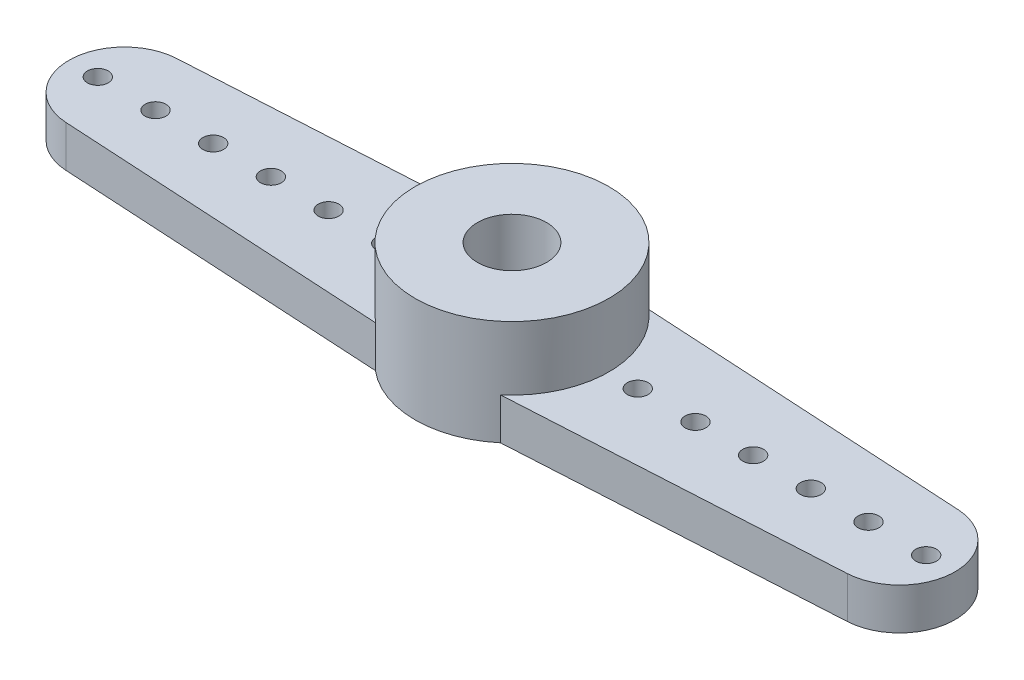
ISO-10303-21;
HEADER;
FILE_DESCRIPTION(('STEP AP214'),'2;1');
FILE_NAME('part.step','',(''),(''),'','','');
FILE_SCHEMA(('AUTOMOTIVE_DESIGN { 1 0 10303 214 1 1 1 1 }'));
ENDSEC;
DATA;
#1=APPLICATION_CONTEXT('core data for automotive mechanical design processes');
#2=APPLICATION_PROTOCOL_DEFINITION('international standard','automotive_design',2000,#1);
#3=PRODUCT_CONTEXT('',#1,'mechanical');
#4=PRODUCT('Part','Part','',(#3));
#5=PRODUCT_RELATED_PRODUCT_CATEGORY('part','',(#4));
#6=PRODUCT_DEFINITION_FORMATION('','',#4);
#7=PRODUCT_DEFINITION_CONTEXT('part definition',#1,'design');
#8=PRODUCT_DEFINITION('design','',#6,#7);
#9=PRODUCT_DEFINITION_SHAPE('','',#8);
#10=(LENGTH_UNIT() NAMED_UNIT(*) SI_UNIT(.MILLI.,.METRE.));
#11=(NAMED_UNIT(*) PLANE_ANGLE_UNIT() SI_UNIT($,.RADIAN.));
#12=(NAMED_UNIT(*) SI_UNIT($,.STERADIAN.) SOLID_ANGLE_UNIT());
#13=UNCERTAINTY_MEASURE_WITH_UNIT(LENGTH_MEASURE(1.E-05),#10,'distance_accuracy_value','');
#14=(GEOMETRIC_REPRESENTATION_CONTEXT(3) GLOBAL_UNCERTAINTY_ASSIGNED_CONTEXT((#13)) GLOBAL_UNIT_ASSIGNED_CONTEXT((#10,
#11,#12)) REPRESENTATION_CONTEXT('',''));
#15=CARTESIAN_POINT('',(0.,0.,0.));
#16=DIRECTION('',(0.,0.,1.));
#17=DIRECTION('',(1.,0.,0.));
#18=AXIS2_PLACEMENT_3D('',#15,#16,#17);
#19=CARTESIAN_POINT('',(0.,1.5,0.));
#20=DIRECTION('',(0.,-1.,0.));
#21=DIRECTION('',(0.,0.,-1.));
#22=AXIS2_PLACEMENT_3D('',#19,#20,#21);
#23=CYLINDRICAL_SURFACE('',#22,3.5);
#24=CARTESIAN_POINT('',(0.,1.5,0.));
#25=DIRECTION('',(0.,1.,0.));
#26=DIRECTION('',(0.,0.,1.));
#27=AXIS2_PLACEMENT_3D('',#24,#25,#26);
#28=CIRCLE('',#27,3.5);
#29=CARTESIAN_POINT('',(-2.25707221860533,1.5,-2.675));
#30=VERTEX_POINT('',#29);
#31=CARTESIAN_POINT('',(-2.25707221860533,1.5,2.675));
#32=VERTEX_POINT('',#31);
#33=EDGE_CURVE('E58',#30,#32,#28,.T.);
#34=ORIENTED_EDGE('',*,*,#33,.T.);
#35=DIRECTION('',(0.,-1.,0.));
#36=VECTOR('',#35,1.);
#37=CARTESIAN_POINT('',(-2.25707221860533,1.5,2.675));
#38=LINE('',#37,#36);
#39=CARTESIAN_POINT('',(-2.25707221860533,0.,2.675));
#40=VERTEX_POINT('',#39);
#41=EDGE_CURVE('E134',#32,#40,#38,.T.);
#42=ORIENTED_EDGE('',*,*,#41,.T.);
#43=CARTESIAN_POINT('',(0.,0.,0.));
#44=DIRECTION('',(0.,1.,0.));
#45=DIRECTION('',(0.,0.,1.));
#46=AXIS2_PLACEMENT_3D('',#43,#44,#45);
#47=CIRCLE('',#46,3.5);
#48=CARTESIAN_POINT('',(2.25707221860533,0.,2.675));
#49=VERTEX_POINT('',#48);
#50=EDGE_CURVE('E214',#40,#49,#47,.T.);
#51=ORIENTED_EDGE('',*,*,#50,.T.);
#52=DIRECTION('',(0.,-1.,0.));
#53=VECTOR('',#52,1.);
#54=CARTESIAN_POINT('',(2.25707221860533,1.5,2.675));
#55=LINE('',#54,#53);
#56=CARTESIAN_POINT('',(2.25707221860533,1.5,2.675));
#57=VERTEX_POINT('',#56);
#58=EDGE_CURVE('E12',#57,#49,#55,.T.);
#59=ORIENTED_EDGE('',*,*,#58,.F.);
#60=CARTESIAN_POINT('',(0.,1.5,0.));
#61=DIRECTION('',(0.,1.,0.));
#62=DIRECTION('',(0.,0.,1.));
#63=AXIS2_PLACEMENT_3D('',#60,#61,#62);
#64=CIRCLE('',#63,3.5);
#65=CARTESIAN_POINT('',(2.25707221860533,1.5,-2.675));
#66=VERTEX_POINT('',#65);
#67=EDGE_CURVE('E206',#57,#66,#64,.T.);
#68=ORIENTED_EDGE('',*,*,#67,.T.);
#69=DIRECTION('',(0.,-1.,0.));
#70=VECTOR('',#69,1.);
#71=CARTESIAN_POINT('',(2.25707221860533,1.5,-2.675));
#72=LINE('',#71,#70);
#73=CARTESIAN_POINT('',(2.25707221860533,0.,-2.675));
#74=VERTEX_POINT('',#73);
#75=EDGE_CURVE('E225',#66,#74,#72,.T.);
#76=ORIENTED_EDGE('',*,*,#75,.T.);
#77=CARTESIAN_POINT('',(-2.25707221860533,0.,-2.675));
#78=VERTEX_POINT('',#77);
#79=EDGE_CURVE('E226',#74,#78,#47,.T.);
#80=ORIENTED_EDGE('',*,*,#79,.T.);
#81=DIRECTION('',(0.,-1.,0.));
#82=VECTOR('',#81,1.);
#83=CARTESIAN_POINT('',(-2.25707221860533,1.5,-2.675));
#84=LINE('',#83,#82);
#85=EDGE_CURVE('E63',#30,#78,#84,.T.);
#86=ORIENTED_EDGE('',*,*,#85,.F.);
#87=EDGE_LOOP('',(#34,#42,#51,#59,#68,#76,#80,#86));
#88=FACE_BOUND('',#87,.T.);
#89=CARTESIAN_POINT('',(0.,3.8,0.));
#90=DIRECTION('',(0.,1.,0.));
#91=DIRECTION('',(0.,0.,1.));
#92=AXIS2_PLACEMENT_3D('',#89,#90,#91);
#93=CIRCLE('',#92,3.5);
#94=CARTESIAN_POINT('',(0.,3.8,3.5));
#95=VERTEX_POINT('',#94);
#96=EDGE_CURVE('E210',#95,#95,#93,.T.);
#97=ORIENTED_EDGE('',*,*,#96,.F.);
#98=EDGE_LOOP('',(#97));
#99=FACE_BOUND('',#98,.T.);
#100=ADVANCED_FACE('F41',(#88,#99),#23,.T.);
#101=CARTESIAN_POINT('',(14.1106495792047,1.5,2.));
#102=DIRECTION('',(-0.0568527304419953,0.,-0.998382575489622));
#103=DIRECTION('',(-0.998382575489622,0.,0.0568527304419953));
#104=AXIS2_PLACEMENT_3D('',#101,#102,#103);
#105=PLANE('',#104);
#106=DIRECTION('',(0.998382575489622,0.,-0.0568527304419953));
#107=VECTOR('',#106,1.);
#108=CARTESIAN_POINT('',(14.1106495792047,0.,2.));
#109=LINE('',#108,#107);
#110=CARTESIAN_POINT('',(14.1106495792047,0.,2.));
#111=VERTEX_POINT('',#110);
#112=EDGE_CURVE('E229',#49,#111,#109,.T.);
#113=ORIENTED_EDGE('',*,*,#112,.T.);
#114=DIRECTION('',(0.,-1.,0.));
#115=VECTOR('',#114,1.);
#116=CARTESIAN_POINT('',(14.1106495792047,1.5,2.));
#117=LINE('',#116,#115);
#118=CARTESIAN_POINT('',(14.1106495792047,1.5,2.));
#119=VERTEX_POINT('',#118);
#120=EDGE_CURVE('E50',#119,#111,#117,.T.);
#121=ORIENTED_EDGE('',*,*,#120,.F.);
#122=DIRECTION('',(0.998382575489622,0.,-0.0568527304419953));
#123=VECTOR('',#122,1.);
#124=CARTESIAN_POINT('',(14.1106495792047,1.5,2.));
#125=LINE('',#124,#123);
#126=EDGE_CURVE('E215',#57,#119,#125,.T.);
#127=ORIENTED_EDGE('',*,*,#126,.F.);
#128=ORIENTED_EDGE('',*,*,#58,.T.);
#129=EDGE_LOOP('',(#113,#121,#127,#128));
#130=FACE_BOUND('',#129,.T.);
#131=ADVANCED_FACE('F334',(#130),#105,.F.);
#132=CARTESIAN_POINT('',(13.9967599103789,1.5,0.));
#133=DIRECTION('',(0.,-1.,0.));
#134=DIRECTION('',(0.,0.,-1.));
#135=AXIS2_PLACEMENT_3D('',#132,#133,#134);
#136=CYLINDRICAL_SURFACE('',#135,2.00324008962113);
#137=CARTESIAN_POINT('',(13.9967599103789,0.,0.));
#138=DIRECTION('',(0.,1.,0.));
#139=DIRECTION('',(0.,0.,-1.));
#140=AXIS2_PLACEMENT_3D('',#137,#138,#139);
#141=CIRCLE('',#140,2.00324008962113);
#142=CARTESIAN_POINT('',(14.1106495792047,0.,-2.));
#143=VERTEX_POINT('',#142);
#144=EDGE_CURVE('E232',#111,#143,#141,.T.);
#145=ORIENTED_EDGE('',*,*,#144,.T.);
#146=DIRECTION('',(0.,-1.,0.));
#147=VECTOR('',#146,1.);
#148=CARTESIAN_POINT('',(14.1106495792047,1.5,-2.));
#149=LINE('',#148,#147);
#150=CARTESIAN_POINT('',(14.1106495792047,1.5,-2.));
#151=VERTEX_POINT('',#150);
#152=EDGE_CURVE('E240',#151,#143,#149,.T.);
#153=ORIENTED_EDGE('',*,*,#152,.F.);
#154=CARTESIAN_POINT('',(13.9967599103789,1.5,0.));
#155=DIRECTION('',(0.,1.,0.));
#156=DIRECTION('',(0.,0.,-1.));
#157=AXIS2_PLACEMENT_3D('',#154,#155,#156);
#158=CIRCLE('',#157,2.00324008962113);
#159=EDGE_CURVE('E218',#119,#151,#158,.T.);
#160=ORIENTED_EDGE('',*,*,#159,.F.);
#161=ORIENTED_EDGE('',*,*,#120,.T.);
#162=EDGE_LOOP('',(#145,#153,#160,#161));
#163=FACE_BOUND('',#162,.T.);
#164=ADVANCED_FACE('F349',(#163),#136,.T.);
#165=CARTESIAN_POINT('',(2.25707221860533,1.5,-2.675));
#166=DIRECTION('',(-0.0568527304419953,0.,0.998382575489622));
#167=DIRECTION('',(0.998382575489622,0.,0.0568527304419953));
#168=AXIS2_PLACEMENT_3D('',#165,#166,#167);
#169=PLANE('',#168);
#170=DIRECTION('',(-0.998382575489622,0.,-0.0568527304419953));
#171=VECTOR('',#170,1.);
#172=CARTESIAN_POINT('',(2.25707221860533,0.,-2.675));
#173=LINE('',#172,#171);
#174=EDGE_CURVE('E219',#143,#74,#173,.T.);
#175=ORIENTED_EDGE('',*,*,#174,.T.);
#176=ORIENTED_EDGE('',*,*,#75,.F.);
#177=DIRECTION('',(-0.998382575489622,0.,-0.0568527304419953));
#178=VECTOR('',#177,1.);
#179=CARTESIAN_POINT('',(2.25707221860533,1.5,-2.675));
#180=LINE('',#179,#178);
#181=EDGE_CURVE('E222',#151,#66,#180,.T.);
#182=ORIENTED_EDGE('',*,*,#181,.F.);
#183=ORIENTED_EDGE('',*,*,#152,.T.);
#184=EDGE_LOOP('',(#175,#176,#182,#183));
#185=FACE_BOUND('',#184,.T.);
#186=ADVANCED_FACE('F345',(#185),#169,.F.);
#187=CARTESIAN_POINT('',(0.,1.5,0.));
#188=DIRECTION('',(0.,1.,0.));
#189=DIRECTION('',(0.,0.,1.));
#190=AXIS2_PLACEMENT_3D('',#187,#188,#189);
#191=PLANE('',#190);
#192=CARTESIAN_POINT('',(14.9583333333333,1.5,0.));
#193=DIRECTION('',(0.,1.,0.));
#194=DIRECTION('',(0.,0.,1.));
#195=AXIS2_PLACEMENT_3D('',#192,#193,#194);
#196=CIRCLE('',#195,0.374999999999988);
#197=CARTESIAN_POINT('',(14.9583333333333,1.5,0.374999999999988));
#198=VERTEX_POINT('',#197);
#199=EDGE_CURVE('E202',#198,#198,#196,.T.);
#200=ORIENTED_EDGE('',*,*,#199,.F.);
#201=EDGE_LOOP('',(#200));
#202=FACE_BOUND('',#201,.T.);
#203=CARTESIAN_POINT('',(12.875,1.5,0.));
#204=DIRECTION('',(0.,1.,0.));
#205=DIRECTION('',(0.,0.,1.));
#206=AXIS2_PLACEMENT_3D('',#203,#204,#205);
#207=CIRCLE('',#206,0.374999999999999);
#208=CARTESIAN_POINT('',(12.875,1.5,0.374999999999999));
#209=VERTEX_POINT('',#208);
#210=EDGE_CURVE('E198',#209,#209,#207,.T.);
#211=ORIENTED_EDGE('',*,*,#210,.F.);
#212=EDGE_LOOP('',(#211));
#213=FACE_BOUND('',#212,.T.);
#214=CARTESIAN_POINT('',(10.7916666666667,1.5,0.));
#215=DIRECTION('',(0.,1.,0.));
#216=DIRECTION('',(0.,0.,1.));
#217=AXIS2_PLACEMENT_3D('',#214,#215,#216);
#218=CIRCLE('',#217,0.374999999999999);
#219=CARTESIAN_POINT('',(10.7916666666667,1.5,0.374999999999999));
#220=VERTEX_POINT('',#219);
#221=EDGE_CURVE('E194',#220,#220,#218,.T.);
#222=ORIENTED_EDGE('',*,*,#221,.F.);
#223=EDGE_LOOP('',(#222));
#224=FACE_BOUND('',#223,.T.);
#225=CARTESIAN_POINT('',(8.70833333333333,1.5,0.));
#226=DIRECTION('',(0.,1.,0.));
#227=DIRECTION('',(0.,0.,1.));
#228=AXIS2_PLACEMENT_3D('',#225,#226,#227);
#229=CIRCLE('',#228,0.374999999999999);
#230=CARTESIAN_POINT('',(8.70833333333333,1.5,0.374999999999999));
#231=VERTEX_POINT('',#230);
#232=EDGE_CURVE('E190',#231,#231,#229,.T.);
#233=ORIENTED_EDGE('',*,*,#232,.F.);
#234=EDGE_LOOP('',(#233));
#235=FACE_BOUND('',#234,.T.);
#236=CARTESIAN_POINT('',(6.625,1.5,0.));
#237=DIRECTION('',(0.,1.,0.));
#238=DIRECTION('',(0.,0.,1.));
#239=AXIS2_PLACEMENT_3D('',#236,#237,#238);
#240=CIRCLE('',#239,0.374999999999999);
#241=CARTESIAN_POINT('',(6.625,1.5,0.374999999999999));
#242=VERTEX_POINT('',#241);
#243=EDGE_CURVE('E186',#242,#242,#240,.T.);
#244=ORIENTED_EDGE('',*,*,#243,.F.);
#245=EDGE_LOOP('',(#244));
#246=FACE_BOUND('',#245,.T.);
#247=CARTESIAN_POINT('',(4.54166666666667,1.5,0.));
#248=DIRECTION('',(0.,1.,0.));
#249=DIRECTION('',(0.,0.,1.));
#250=AXIS2_PLACEMENT_3D('',#247,#248,#249);
#251=CIRCLE('',#250,0.374999999999999);
#252=CARTESIAN_POINT('',(4.54166666666667,1.5,0.374999999999999));
#253=VERTEX_POINT('',#252);
#254=EDGE_CURVE('E159',#253,#253,#251,.T.);
#255=ORIENTED_EDGE('',*,*,#254,.F.);
#256=EDGE_LOOP('',(#255));
#257=FACE_BOUND('',#256,.T.);
#258=ORIENTED_EDGE('',*,*,#67,.F.);
#259=ORIENTED_EDGE('',*,*,#126,.T.);
#260=ORIENTED_EDGE('',*,*,#159,.T.);
#261=ORIENTED_EDGE('',*,*,#181,.T.);
#262=EDGE_LOOP('',(#258,#259,#260,#261));
#263=FACE_BOUND('',#262,.T.);
#264=ADVANCED_FACE('F314',(#202,#213,#224,#235,#246,#257,#263),#191,.T.);
#265=CARTESIAN_POINT('',(0.,0.,0.));
#266=DIRECTION('',(0.,1.,0.));
#267=DIRECTION('',(0.,0.,1.));
#268=AXIS2_PLACEMENT_3D('',#265,#266,#267);
#269=PLANE('',#268);
#270=CARTESIAN_POINT('',(-14.9583333333333,0.,0.));
#271=DIRECTION('',(0.,-1.,0.));
#272=DIRECTION('',(0.,0.,1.));
#273=AXIS2_PLACEMENT_3D('',#270,#271,#272);
#274=CIRCLE('',#273,0.374999999999988);
#275=CARTESIAN_POINT('',(-14.9583333333333,0.,0.374999999999988));
#276=VERTEX_POINT('',#275);
#277=EDGE_CURVE('E252',#276,#276,#274,.T.);
#278=ORIENTED_EDGE('',*,*,#277,.F.);
#279=EDGE_LOOP('',(#278));
#280=FACE_BOUND('',#279,.T.);
#281=CARTESIAN_POINT('',(-12.875,0.,0.));
#282=DIRECTION('',(0.,-1.,0.));
#283=DIRECTION('',(0.,0.,1.));
#284=AXIS2_PLACEMENT_3D('',#281,#282,#283);
#285=CIRCLE('',#284,0.374999999999999);
#286=CARTESIAN_POINT('',(-12.875,0.,0.374999999999999));
#287=VERTEX_POINT('',#286);
#288=EDGE_CURVE('E282',#287,#287,#285,.T.);
#289=ORIENTED_EDGE('',*,*,#288,.F.);
#290=EDGE_LOOP('',(#289));
#291=FACE_BOUND('',#290,.T.);
#292=CARTESIAN_POINT('',(-10.7916666666667,0.,0.));
#293=DIRECTION('',(0.,-1.,0.));
#294=DIRECTION('',(0.,0.,1.));
#295=AXIS2_PLACEMENT_3D('',#292,#293,#294);
#296=CIRCLE('',#295,0.374999999999999);
#297=CARTESIAN_POINT('',(-10.7916666666667,0.,0.374999999999999));
#298=VERTEX_POINT('',#297);
#299=EDGE_CURVE('E286',#298,#298,#296,.T.);
#300=ORIENTED_EDGE('',*,*,#299,.F.);
#301=EDGE_LOOP('',(#300));
#302=FACE_BOUND('',#301,.T.);
#303=CARTESIAN_POINT('',(-8.70833333333333,0.,0.));
#304=DIRECTION('',(0.,-1.,0.));
#305=DIRECTION('',(0.,0.,1.));
#306=AXIS2_PLACEMENT_3D('',#303,#304,#305);
#307=CIRCLE('',#306,0.374999999999999);
#308=CARTESIAN_POINT('',(-8.70833333333333,0.,0.374999999999999));
#309=VERTEX_POINT('',#308);
#310=EDGE_CURVE('E292',#309,#309,#307,.T.);
#311=ORIENTED_EDGE('',*,*,#310,.F.);
#312=EDGE_LOOP('',(#311));
#313=FACE_BOUND('',#312,.T.);
#314=CARTESIAN_POINT('',(-6.625,0.,0.));
#315=DIRECTION('',(0.,-1.,0.));
#316=DIRECTION('',(0.,0.,1.));
#317=AXIS2_PLACEMENT_3D('',#314,#315,#316);
#318=CIRCLE('',#317,0.374999999999999);
#319=CARTESIAN_POINT('',(-6.625,0.,0.374999999999999));
#320=VERTEX_POINT('',#319);
#321=EDGE_CURVE('E296',#320,#320,#318,.T.);
#322=ORIENTED_EDGE('',*,*,#321,.F.);
#323=EDGE_LOOP('',(#322));
#324=FACE_BOUND('',#323,.T.);
#325=CARTESIAN_POINT('',(-4.54166666666667,0.,0.));
#326=DIRECTION('',(0.,-1.,0.));
#327=DIRECTION('',(0.,0.,1.));
#328=AXIS2_PLACEMENT_3D('',#325,#326,#327);
#329=CIRCLE('',#328,0.374999999999999);
#330=CARTESIAN_POINT('',(-4.54166666666667,0.,0.374999999999999));
#331=VERTEX_POINT('',#330);
#332=EDGE_CURVE('E300',#331,#331,#329,.T.);
#333=ORIENTED_EDGE('',*,*,#332,.F.);
#334=EDGE_LOOP('',(#333));
#335=FACE_BOUND('',#334,.T.);
#336=CARTESIAN_POINT('',(0.,0.,0.));
#337=DIRECTION('',(0.,-1.,0.));
#338=DIRECTION('',(0.,0.,1.));
#339=AXIS2_PLACEMENT_3D('',#336,#337,#338);
#340=CIRCLE('',#339,1.25);
#341=CARTESIAN_POINT('',(0.,0.,1.25));
#342=VERTEX_POINT('',#341);
#343=EDGE_CURVE('E303',#342,#342,#340,.T.);
#344=ORIENTED_EDGE('',*,*,#343,.F.);
#345=EDGE_LOOP('',(#344));
#346=FACE_BOUND('',#345,.T.);
#347=CARTESIAN_POINT('',(14.9583333333333,0.,0.));
#348=DIRECTION('',(0.,1.,0.));
#349=DIRECTION('',(0.,0.,1.));
#350=AXIS2_PLACEMENT_3D('',#347,#348,#349);
#351=CIRCLE('',#350,0.374999999999988);
#352=CARTESIAN_POINT('',(14.9583333333333,0.,0.374999999999988));
#353=VERTEX_POINT('',#352);
#354=EDGE_CURVE('E155',#353,#353,#351,.T.);
#355=ORIENTED_EDGE('',*,*,#354,.T.);
#356=EDGE_LOOP('',(#355));
#357=FACE_BOUND('',#356,.T.);
#358=CARTESIAN_POINT('',(12.875,0.,0.));
#359=DIRECTION('',(0.,1.,0.));
#360=DIRECTION('',(0.,0.,1.));
#361=AXIS2_PLACEMENT_3D('',#358,#359,#360);
#362=CIRCLE('',#361,0.374999999999999);
#363=CARTESIAN_POINT('',(12.875,0.,0.374999999999999));
#364=VERTEX_POINT('',#363);
#365=EDGE_CURVE('E160',#364,#364,#362,.T.);
#366=ORIENTED_EDGE('',*,*,#365,.T.);
#367=EDGE_LOOP('',(#366));
#368=FACE_BOUND('',#367,.T.);
#369=CARTESIAN_POINT('',(10.7916666666667,0.,0.));
#370=DIRECTION('',(0.,1.,0.));
#371=DIRECTION('',(0.,0.,1.));
#372=AXIS2_PLACEMENT_3D('',#369,#370,#371);
#373=CIRCLE('',#372,0.374999999999999);
#374=CARTESIAN_POINT('',(10.7916666666667,0.,0.374999999999999));
#375=VERTEX_POINT('',#374);
#376=EDGE_CURVE('E164',#375,#375,#373,.T.);
#377=ORIENTED_EDGE('',*,*,#376,.T.);
#378=EDGE_LOOP('',(#377));
#379=FACE_BOUND('',#378,.T.);
#380=CARTESIAN_POINT('',(8.70833333333333,0.,0.));
#381=DIRECTION('',(0.,1.,0.));
#382=DIRECTION('',(0.,0.,1.));
#383=AXIS2_PLACEMENT_3D('',#380,#381,#382);
#384=CIRCLE('',#383,0.374999999999999);
#385=CARTESIAN_POINT('',(8.70833333333333,0.,0.374999999999999));
#386=VERTEX_POINT('',#385);
#387=EDGE_CURVE('E168',#386,#386,#384,.T.);
#388=ORIENTED_EDGE('',*,*,#387,.T.);
#389=EDGE_LOOP('',(#388));
#390=FACE_BOUND('',#389,.T.);
#391=CARTESIAN_POINT('',(6.625,0.,0.));
#392=DIRECTION('',(0.,1.,0.));
#393=DIRECTION('',(0.,0.,1.));
#394=AXIS2_PLACEMENT_3D('',#391,#392,#393);
#395=CIRCLE('',#394,0.374999999999999);
#396=CARTESIAN_POINT('',(6.625,0.,0.374999999999999));
#397=VERTEX_POINT('',#396);
#398=EDGE_CURVE('E172',#397,#397,#395,.T.);
#399=ORIENTED_EDGE('',*,*,#398,.T.);
#400=EDGE_LOOP('',(#399));
#401=FACE_BOUND('',#400,.T.);
#402=CARTESIAN_POINT('',(4.54166666666667,0.,0.));
#403=DIRECTION('',(0.,1.,0.));
#404=DIRECTION('',(0.,0.,1.));
#405=AXIS2_PLACEMENT_3D('',#402,#403,#404);
#406=CIRCLE('',#405,0.374999999999999);
#407=CARTESIAN_POINT('',(4.54166666666667,0.,0.374999999999999));
#408=VERTEX_POINT('',#407);
#409=EDGE_CURVE('E176',#408,#408,#406,.T.);
#410=ORIENTED_EDGE('',*,*,#409,.T.);
#411=EDGE_LOOP('',(#410));
#412=FACE_BOUND('',#411,.T.);
#413=ORIENTED_EDGE('',*,*,#112,.F.);
#414=ORIENTED_EDGE('',*,*,#50,.F.);
#415=DIRECTION('',(-0.998382575489622,0.,-0.0568527304419953));
#416=VECTOR('',#415,1.);
#417=CARTESIAN_POINT('',(-14.1106495792047,0.,2.));
#418=LINE('',#417,#416);
#419=CARTESIAN_POINT('',(-14.1106495792047,0.,2.));
#420=VERTEX_POINT('',#419);
#421=EDGE_CURVE('E127',#40,#420,#418,.T.);
#422=ORIENTED_EDGE('',*,*,#421,.T.);
#423=CARTESIAN_POINT('',(-13.9967599103789,0.,0.));
#424=DIRECTION('',(0.,-1.,0.));
#425=DIRECTION('',(0.,0.,-1.));
#426=AXIS2_PLACEMENT_3D('',#423,#424,#425);
#427=CIRCLE('',#426,2.00324008962113);
#428=CARTESIAN_POINT('',(-14.1106495792047,0.,-2.));
#429=VERTEX_POINT('',#428);
#430=EDGE_CURVE('E140',#420,#429,#427,.T.);
#431=ORIENTED_EDGE('',*,*,#430,.T.);
#432=DIRECTION('',(0.998382575489622,0.,-0.0568527304419953));
#433=VECTOR('',#432,1.);
#434=CARTESIAN_POINT('',(-2.25707221860533,0.,-2.675));
#435=LINE('',#434,#433);
#436=EDGE_CURVE('E112',#429,#78,#435,.T.);
#437=ORIENTED_EDGE('',*,*,#436,.T.);
#438=ORIENTED_EDGE('',*,*,#79,.F.);
#439=ORIENTED_EDGE('',*,*,#174,.F.);
#440=ORIENTED_EDGE('',*,*,#144,.F.);
#441=EDGE_LOOP('',(#413,#414,#422,#431,#437,#438,#439,#440));
#442=FACE_BOUND('',#441,.T.);
#443=ADVANCED_FACE('F310',(#280,#291,#302,#313,#324,#335,#346,#357,#368,#379,#390,#401,#412,
#442),#269,.F.);
#444=CARTESIAN_POINT('',(0.,3.8,0.));
#445=DIRECTION('',(0.,1.,0.));
#446=DIRECTION('',(0.,0.,1.));
#447=AXIS2_PLACEMENT_3D('',#444,#445,#446);
#448=PLANE('',#447);
#449=CARTESIAN_POINT('',(0.,3.8,0.));
#450=DIRECTION('',(0.,1.,0.));
#451=DIRECTION('',(0.,0.,1.));
#452=AXIS2_PLACEMENT_3D('',#449,#450,#451);
#453=CIRCLE('',#452,1.25);
#454=CARTESIAN_POINT('',(0.,3.8,1.25));
#455=VERTEX_POINT('',#454);
#456=EDGE_CURVE('E154',#455,#455,#453,.T.);
#457=ORIENTED_EDGE('',*,*,#456,.F.);
#458=EDGE_LOOP('',(#457));
#459=FACE_BOUND('',#458,.T.);
#460=ORIENTED_EDGE('',*,*,#96,.T.);
#461=EDGE_LOOP('',(#460));
#462=FACE_BOUND('',#461,.T.);
#463=ADVANCED_FACE('F313',(#459,#462),#448,.T.);
#464=CARTESIAN_POINT('',(0.,0.,0.));
#465=DIRECTION('',(0.,1.,0.));
#466=DIRECTION('',(0.,0.,1.));
#467=AXIS2_PLACEMENT_3D('',#464,#465,#466);
#468=CYLINDRICAL_SURFACE('',#467,1.25);
#469=ORIENTED_EDGE('',*,*,#456,.T.);
#470=EDGE_LOOP('',(#469));
#471=FACE_BOUND('',#470,.T.);
#472=ORIENTED_EDGE('',*,*,#343,.T.);
#473=EDGE_LOOP('',(#472));
#474=FACE_BOUND('',#473,.T.);
#475=ADVANCED_FACE('F308',(#471,#474),#468,.F.);
#476=CARTESIAN_POINT('',(4.54166666666667,0.,0.));
#477=DIRECTION('',(0.,1.,0.));
#478=DIRECTION('',(0.,0.,1.));
#479=AXIS2_PLACEMENT_3D('',#476,#477,#478);
#480=CYLINDRICAL_SURFACE('',#479,0.374999999999999);
#481=ORIENTED_EDGE('',*,*,#254,.T.);
#482=EDGE_LOOP('',(#481));
#483=FACE_BOUND('',#482,.T.);
#484=ORIENTED_EDGE('',*,*,#409,.F.);
#485=EDGE_LOOP('',(#484));
#486=FACE_BOUND('',#485,.T.);
#487=ADVANCED_FACE('F398',(#483,#486),#480,.F.);
#488=CARTESIAN_POINT('',(6.625,0.,0.));
#489=DIRECTION('',(0.,1.,0.));
#490=DIRECTION('',(0.,0.,1.));
#491=AXIS2_PLACEMENT_3D('',#488,#489,#490);
#492=CYLINDRICAL_SURFACE('',#491,0.374999999999999);
#493=ORIENTED_EDGE('',*,*,#243,.T.);
#494=EDGE_LOOP('',(#493));
#495=FACE_BOUND('',#494,.T.);
#496=ORIENTED_EDGE('',*,*,#398,.F.);
#497=EDGE_LOOP('',(#496));
#498=FACE_BOUND('',#497,.T.);
#499=ADVANCED_FACE('F402',(#495,#498),#492,.F.);
#500=CARTESIAN_POINT('',(8.70833333333333,0.,0.));
#501=DIRECTION('',(0.,1.,0.));
#502=DIRECTION('',(0.,0.,1.));
#503=AXIS2_PLACEMENT_3D('',#500,#501,#502);
#504=CYLINDRICAL_SURFACE('',#503,0.374999999999999);
#505=ORIENTED_EDGE('',*,*,#232,.T.);
#506=EDGE_LOOP('',(#505));
#507=FACE_BOUND('',#506,.T.);
#508=ORIENTED_EDGE('',*,*,#387,.F.);
#509=EDGE_LOOP('',(#508));
#510=FACE_BOUND('',#509,.T.);
#511=ADVANCED_FACE('F412',(#507,#510),#504,.F.);
#512=CARTESIAN_POINT('',(10.7916666666667,0.,0.));
#513=DIRECTION('',(0.,1.,0.));
#514=DIRECTION('',(0.,0.,1.));
#515=AXIS2_PLACEMENT_3D('',#512,#513,#514);
#516=CYLINDRICAL_SURFACE('',#515,0.374999999999999);
#517=ORIENTED_EDGE('',*,*,#221,.T.);
#518=EDGE_LOOP('',(#517));
#519=FACE_BOUND('',#518,.T.);
#520=ORIENTED_EDGE('',*,*,#376,.F.);
#521=EDGE_LOOP('',(#520));
#522=FACE_BOUND('',#521,.T.);
#523=ADVANCED_FACE('F422',(#519,#522),#516,.F.);
#524=CARTESIAN_POINT('',(12.875,0.,0.));
#525=DIRECTION('',(0.,1.,0.));
#526=DIRECTION('',(0.,0.,1.));
#527=AXIS2_PLACEMENT_3D('',#524,#525,#526);
#528=CYLINDRICAL_SURFACE('',#527,0.374999999999999);
#529=ORIENTED_EDGE('',*,*,#210,.T.);
#530=EDGE_LOOP('',(#529));
#531=FACE_BOUND('',#530,.T.);
#532=ORIENTED_EDGE('',*,*,#365,.F.);
#533=EDGE_LOOP('',(#532));
#534=FACE_BOUND('',#533,.T.);
#535=ADVANCED_FACE('F432',(#531,#534),#528,.F.);
#536=CARTESIAN_POINT('',(14.9583333333333,0.,0.));
#537=DIRECTION('',(0.,1.,0.));
#538=DIRECTION('',(0.,0.,1.));
#539=AXIS2_PLACEMENT_3D('',#536,#537,#538);
#540=CYLINDRICAL_SURFACE('',#539,0.374999999999988);
#541=ORIENTED_EDGE('',*,*,#199,.T.);
#542=EDGE_LOOP('',(#541));
#543=FACE_BOUND('',#542,.T.);
#544=ORIENTED_EDGE('',*,*,#354,.F.);
#545=EDGE_LOOP('',(#544));
#546=FACE_BOUND('',#545,.T.);
#547=ADVANCED_FACE('F441',(#543,#546),#540,.F.);
#548=CARTESIAN_POINT('',(0.,1.5,0.));
#549=DIRECTION('',(0.,1.,0.));
#550=DIRECTION('',(0.,0.,1.));
#551=AXIS2_PLACEMENT_3D('',#548,#549,#550);
#552=PLANE('',#551);
#553=CARTESIAN_POINT('',(-14.9583333333333,1.5,0.));
#554=DIRECTION('',(0.,1.,0.));
#555=DIRECTION('',(0.,0.,1.));
#556=AXIS2_PLACEMENT_3D('',#553,#554,#555);
#557=CIRCLE('',#556,0.374999999999988);
#558=CARTESIAN_POINT('',(-14.9583333333333,1.5,0.374999999999988));
#559=VERTEX_POINT('',#558);
#560=EDGE_CURVE('E44',#559,#559,#557,.F.);
#561=ORIENTED_EDGE('',*,*,#560,.T.);
#562=EDGE_LOOP('',(#561));
#563=FACE_BOUND('',#562,.T.);
#564=CARTESIAN_POINT('',(-12.875,1.5,0.));
#565=DIRECTION('',(0.,1.,0.));
#566=DIRECTION('',(0.,0.,1.));
#567=AXIS2_PLACEMENT_3D('',#564,#565,#566);
#568=CIRCLE('',#567,0.374999999999999);
#569=CARTESIAN_POINT('',(-12.875,1.5,0.374999999999999));
#570=VERTEX_POINT('',#569);
#571=EDGE_CURVE('E263',#570,#570,#568,.F.);
#572=ORIENTED_EDGE('',*,*,#571,.T.);
#573=EDGE_LOOP('',(#572));
#574=FACE_BOUND('',#573,.T.);
#575=CARTESIAN_POINT('',(-10.7916666666667,1.5,0.));
#576=DIRECTION('',(0.,1.,0.));
#577=DIRECTION('',(0.,0.,1.));
#578=AXIS2_PLACEMENT_3D('',#575,#576,#577);
#579=CIRCLE('',#578,0.374999999999999);
#580=CARTESIAN_POINT('',(-10.7916666666667,1.5,0.374999999999999));
#581=VERTEX_POINT('',#580);
#582=EDGE_CURVE('E260',#581,#581,#579,.F.);
#583=ORIENTED_EDGE('',*,*,#582,.T.);
#584=EDGE_LOOP('',(#583));
#585=FACE_BOUND('',#584,.T.);
#586=CARTESIAN_POINT('',(-8.70833333333333,1.5,0.));
#587=DIRECTION('',(0.,1.,0.));
#588=DIRECTION('',(0.,0.,1.));
#589=AXIS2_PLACEMENT_3D('',#586,#587,#588);
#590=CIRCLE('',#589,0.374999999999999);
#591=CARTESIAN_POINT('',(-8.70833333333333,1.5,0.374999999999999));
#592=VERTEX_POINT('',#591);
#593=EDGE_CURVE('E256',#592,#592,#590,.F.);
#594=ORIENTED_EDGE('',*,*,#593,.T.);
#595=EDGE_LOOP('',(#594));
#596=FACE_BOUND('',#595,.T.);
#597=CARTESIAN_POINT('',(-6.625,1.5,0.));
#598=DIRECTION('',(0.,1.,0.));
#599=DIRECTION('',(0.,0.,1.));
#600=AXIS2_PLACEMENT_3D('',#597,#598,#599);
#601=CIRCLE('',#600,0.374999999999999);
#602=CARTESIAN_POINT('',(-6.625,1.5,0.374999999999999));
#603=VERTEX_POINT('',#602);
#604=EDGE_CURVE('E251',#603,#603,#601,.F.);
#605=ORIENTED_EDGE('',*,*,#604,.T.);
#606=EDGE_LOOP('',(#605));
#607=FACE_BOUND('',#606,.T.);
#608=CARTESIAN_POINT('',(-4.54166666666667,1.5,0.));
#609=DIRECTION('',(0.,1.,0.));
#610=DIRECTION('',(0.,0.,1.));
#611=AXIS2_PLACEMENT_3D('',#608,#609,#610);
#612=CIRCLE('',#611,0.374999999999999);
#613=CARTESIAN_POINT('',(-4.54166666666667,1.5,0.374999999999999));
#614=VERTEX_POINT('',#613);
#615=EDGE_CURVE('E247',#614,#614,#612,.F.);
#616=ORIENTED_EDGE('',*,*,#615,.T.);
#617=EDGE_LOOP('',(#616));
#618=FACE_BOUND('',#617,.T.);
#619=ORIENTED_EDGE('',*,*,#33,.F.);
#620=DIRECTION('',(0.998382575489622,0.,-0.0568527304419953));
#621=VECTOR('',#620,1.);
#622=CARTESIAN_POINT('',(-2.25707221860533,1.5,-2.675));
#623=LINE('',#622,#621);
#624=CARTESIAN_POINT('',(-14.1106495792047,1.5,-2.));
#625=VERTEX_POINT('',#624);
#626=EDGE_CURVE('E110',#625,#30,#623,.T.);
#627=ORIENTED_EDGE('',*,*,#626,.F.);
#628=CARTESIAN_POINT('',(-13.9967599103789,1.5,0.));
#629=DIRECTION('',(0.,-1.,0.));
#630=DIRECTION('',(0.,0.,-1.));
#631=AXIS2_PLACEMENT_3D('',#628,#629,#630);
#632=CIRCLE('',#631,2.00324008962113);
#633=CARTESIAN_POINT('',(-14.1106495792047,1.5,2.));
#634=VERTEX_POINT('',#633);
#635=EDGE_CURVE('E124',#634,#625,#632,.T.);
#636=ORIENTED_EDGE('',*,*,#635,.F.);
#637=DIRECTION('',(-0.998382575489622,0.,-0.0568527304419953));
#638=VECTOR('',#637,1.);
#639=CARTESIAN_POINT('',(-14.1106495792047,1.5,2.));
#640=LINE('',#639,#638);
#641=EDGE_CURVE('E131',#32,#634,#640,.T.);
#642=ORIENTED_EDGE('',*,*,#641,.F.);
#643=EDGE_LOOP('',(#619,#627,#636,#642));
#644=FACE_BOUND('',#643,.T.);
#645=ADVANCED_FACE('F122',(#563,#574,#585,#596,#607,#618,#644),#552,.T.);
#646=CARTESIAN_POINT('',(-2.25707221860533,1.5,-2.675));
#647=DIRECTION('',(-0.0568527304419953,0.,-0.998382575489622));
#648=DIRECTION('',(-0.998382575489622,0.,0.0568527304419953));
#649=AXIS2_PLACEMENT_3D('',#646,#647,#648);
#650=PLANE('',#649);
#651=ORIENTED_EDGE('',*,*,#436,.F.);
#652=DIRECTION('',(0.,-1.,0.));
#653=VECTOR('',#652,1.);
#654=CARTESIAN_POINT('',(-14.1106495792047,1.5,-2.));
#655=LINE('',#654,#653);
#656=EDGE_CURVE('E107',#625,#429,#655,.T.);
#657=ORIENTED_EDGE('',*,*,#656,.F.);
#658=ORIENTED_EDGE('',*,*,#626,.T.);
#659=ORIENTED_EDGE('',*,*,#85,.T.);
#660=EDGE_LOOP('',(#651,#657,#658,#659));
#661=FACE_BOUND('',#660,.T.);
#662=ADVANCED_FACE('F109',(#661),#650,.T.);
#663=CARTESIAN_POINT('',(-13.9967599103789,1.5,0.));
#664=DIRECTION('',(0.,-1.,0.));
#665=DIRECTION('',(0.,0.,-1.));
#666=AXIS2_PLACEMENT_3D('',#663,#664,#665);
#667=CYLINDRICAL_SURFACE('',#666,2.00324008962113);
#668=ORIENTED_EDGE('',*,*,#430,.F.);
#669=DIRECTION('',(0.,-1.,0.));
#670=VECTOR('',#669,1.);
#671=CARTESIAN_POINT('',(-14.1106495792047,1.5,2.));
#672=LINE('',#671,#670);
#673=EDGE_CURVE('E118',#634,#420,#672,.T.);
#674=ORIENTED_EDGE('',*,*,#673,.F.);
#675=ORIENTED_EDGE('',*,*,#635,.T.);
#676=ORIENTED_EDGE('',*,*,#656,.T.);
#677=EDGE_LOOP('',(#668,#674,#675,#676));
#678=FACE_BOUND('',#677,.T.);
#679=ADVANCED_FACE('F129',(#678),#667,.T.);
#680=CARTESIAN_POINT('',(-14.1106495792047,1.5,2.));
#681=DIRECTION('',(-0.0568527304419953,0.,0.998382575489622));
#682=DIRECTION('',(0.998382575489622,0.,0.0568527304419953));
#683=AXIS2_PLACEMENT_3D('',#680,#681,#682);
#684=PLANE('',#683);
#685=ORIENTED_EDGE('',*,*,#421,.F.);
#686=ORIENTED_EDGE('',*,*,#41,.F.);
#687=ORIENTED_EDGE('',*,*,#641,.T.);
#688=ORIENTED_EDGE('',*,*,#673,.T.);
#689=EDGE_LOOP('',(#685,#686,#687,#688));
#690=FACE_BOUND('',#689,.T.);
#691=ADVANCED_FACE('F340',(#690),#684,.T.);
#692=CARTESIAN_POINT('',(-4.54166666666667,0.,0.));
#693=DIRECTION('',(0.,1.,0.));
#694=DIRECTION('',(0.,0.,1.));
#695=AXIS2_PLACEMENT_3D('',#692,#693,#694);
#696=CYLINDRICAL_SURFACE('',#695,0.374999999999999);
#697=ORIENTED_EDGE('',*,*,#615,.F.);
#698=EDGE_LOOP('',(#697));
#699=FACE_BOUND('',#698,.T.);
#700=ORIENTED_EDGE('',*,*,#332,.T.);
#701=EDGE_LOOP('',(#700));
#702=FACE_BOUND('',#701,.T.);
#703=ADVANCED_FACE('F487',(#699,#702),#696,.F.);
#704=CARTESIAN_POINT('',(-6.625,0.,0.));
#705=DIRECTION('',(0.,1.,0.));
#706=DIRECTION('',(0.,0.,1.));
#707=AXIS2_PLACEMENT_3D('',#704,#705,#706);
#708=CYLINDRICAL_SURFACE('',#707,0.374999999999999);
#709=ORIENTED_EDGE('',*,*,#604,.F.);
#710=EDGE_LOOP('',(#709));
#711=FACE_BOUND('',#710,.T.);
#712=ORIENTED_EDGE('',*,*,#321,.T.);
#713=EDGE_LOOP('',(#712));
#714=FACE_BOUND('',#713,.T.);
#715=ADVANCED_FACE('F494',(#711,#714),#708,.F.);
#716=CARTESIAN_POINT('',(-8.70833333333333,0.,0.));
#717=DIRECTION('',(0.,1.,0.));
#718=DIRECTION('',(0.,0.,1.));
#719=AXIS2_PLACEMENT_3D('',#716,#717,#718);
#720=CYLINDRICAL_SURFACE('',#719,0.374999999999999);
#721=ORIENTED_EDGE('',*,*,#593,.F.);
#722=EDGE_LOOP('',(#721));
#723=FACE_BOUND('',#722,.T.);
#724=ORIENTED_EDGE('',*,*,#310,.T.);
#725=EDGE_LOOP('',(#724));
#726=FACE_BOUND('',#725,.T.);
#727=ADVANCED_FACE('F502',(#723,#726),#720,.F.);
#728=CARTESIAN_POINT('',(-10.7916666666667,0.,0.));
#729=DIRECTION('',(0.,1.,0.));
#730=DIRECTION('',(0.,0.,1.));
#731=AXIS2_PLACEMENT_3D('',#728,#729,#730);
#732=CYLINDRICAL_SURFACE('',#731,0.374999999999999);
#733=ORIENTED_EDGE('',*,*,#582,.F.);
#734=EDGE_LOOP('',(#733));
#735=FACE_BOUND('',#734,.T.);
#736=ORIENTED_EDGE('',*,*,#299,.T.);
#737=EDGE_LOOP('',(#736));
#738=FACE_BOUND('',#737,.T.);
#739=ADVANCED_FACE('F510',(#735,#738),#732,.F.);
#740=CARTESIAN_POINT('',(-12.875,0.,0.));
#741=DIRECTION('',(0.,1.,0.));
#742=DIRECTION('',(0.,0.,1.));
#743=AXIS2_PLACEMENT_3D('',#740,#741,#742);
#744=CYLINDRICAL_SURFACE('',#743,0.374999999999999);
#745=ORIENTED_EDGE('',*,*,#571,.F.);
#746=EDGE_LOOP('',(#745));
#747=FACE_BOUND('',#746,.T.);
#748=ORIENTED_EDGE('',*,*,#288,.T.);
#749=EDGE_LOOP('',(#748));
#750=FACE_BOUND('',#749,.T.);
#751=ADVANCED_FACE('F276',(#747,#750),#744,.F.);
#752=CARTESIAN_POINT('',(-14.9583333333333,0.,0.));
#753=DIRECTION('',(0.,1.,0.));
#754=DIRECTION('',(0.,0.,1.));
#755=AXIS2_PLACEMENT_3D('',#752,#753,#754);
#756=CYLINDRICAL_SURFACE('',#755,0.374999999999988);
#757=ORIENTED_EDGE('',*,*,#560,.F.);
#758=EDGE_LOOP('',(#757));
#759=FACE_BOUND('',#758,.T.);
#760=ORIENTED_EDGE('',*,*,#277,.T.);
#761=EDGE_LOOP('',(#760));
#762=FACE_BOUND('',#761,.T.);
#763=ADVANCED_FACE('F273',(#759,#762),#756,.F.);
#764=CLOSED_SHELL('',(#100,#131,#164,#186,#264,#443,#463,#475,#487,#499,#511,#523,#535,#547,
#645,#662,#679,#691,#703,#715,#727,#739,#751,#763));
#765=MANIFOLD_SOLID_BREP('B2',#764);
#766=ADVANCED_BREP_SHAPE_REPRESENTATION('',(#18,#765),#14);
#767=SHAPE_DEFINITION_REPRESENTATION(#9,#766);
ENDSEC;
END-ISO-10303-21;
